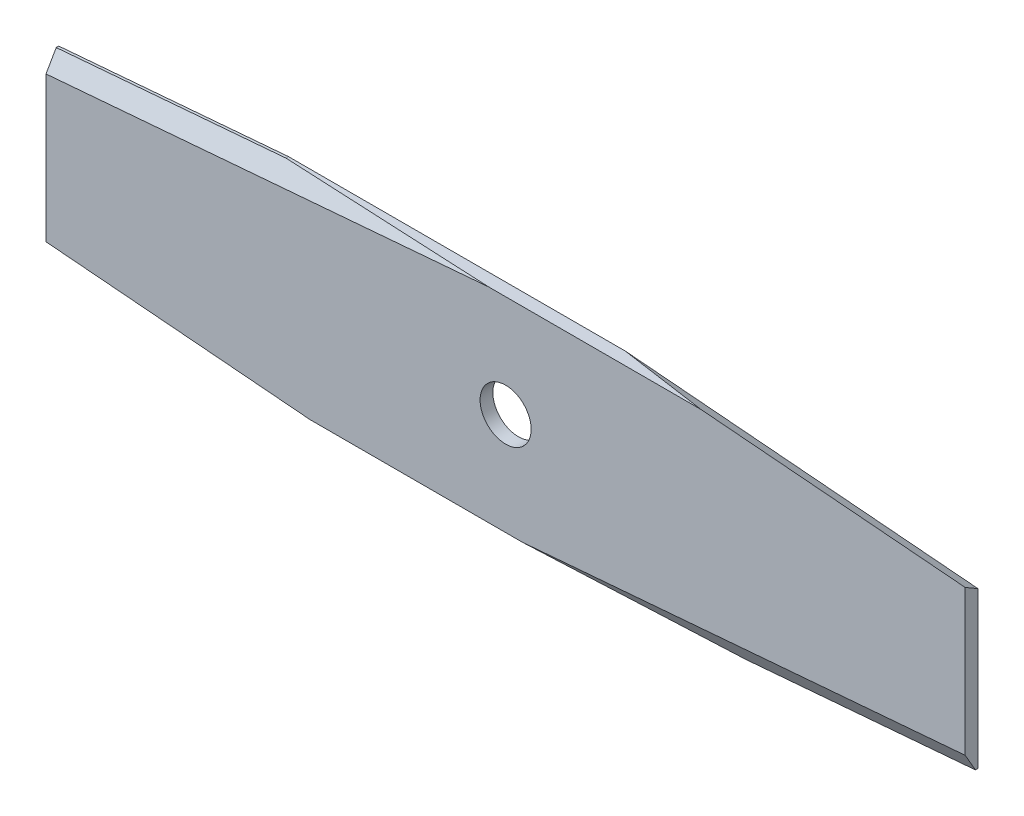
ISO-10303-21;
HEADER;
FILE_DESCRIPTION(('STEP AP214'),'2;1');
FILE_NAME('part.step','',(''),(''),'','','');
FILE_SCHEMA(('AUTOMOTIVE_DESIGN { 1 0 10303 214 1 1 1 1 }'));
ENDSEC;
DATA;
#1=APPLICATION_CONTEXT('core data for automotive mechanical design processes');
#2=APPLICATION_PROTOCOL_DEFINITION('international standard','automotive_design',2000,#1);
#3=PRODUCT_CONTEXT('',#1,'mechanical');
#4=PRODUCT('Part','Part','',(#3));
#5=PRODUCT_RELATED_PRODUCT_CATEGORY('part','',(#4));
#6=PRODUCT_DEFINITION_FORMATION('','',#4);
#7=PRODUCT_DEFINITION_CONTEXT('part definition',#1,'design');
#8=PRODUCT_DEFINITION('design','',#6,#7);
#9=PRODUCT_DEFINITION_SHAPE('','',#8);
#10=(LENGTH_UNIT() NAMED_UNIT(*) SI_UNIT(.MILLI.,.METRE.));
#11=(NAMED_UNIT(*) PLANE_ANGLE_UNIT() SI_UNIT($,.RADIAN.));
#12=(NAMED_UNIT(*) SI_UNIT($,.STERADIAN.) SOLID_ANGLE_UNIT());
#13=UNCERTAINTY_MEASURE_WITH_UNIT(LENGTH_MEASURE(1.E-05),#10,'distance_accuracy_value','');
#14=(GEOMETRIC_REPRESENTATION_CONTEXT(3) GLOBAL_UNCERTAINTY_ASSIGNED_CONTEXT((#13)) GLOBAL_UNIT_ASSIGNED_CONTEXT((#10,
#11,#12)) REPRESENTATION_CONTEXT('',''));
#15=CARTESIAN_POINT('',(0.,0.,0.));
#16=DIRECTION('',(0.,0.,1.));
#17=DIRECTION('',(1.,0.,0.));
#18=AXIS2_PLACEMENT_3D('',#15,#16,#17);
#19=CARTESIAN_POINT('',(-57.15,25.4,3.175));
#20=DIRECTION('',(0.0830454798537402,-0.99654575824488,0.));
#21=DIRECTION('',(0.99654575824488,0.0830454798537402,0.));
#22=AXIS2_PLACEMENT_3D('',#19,#20,#21);
#23=PLANE('',#22);
#24=DIRECTION('',(0.,0.,-1.));
#25=VECTOR('',#24,1.);
#26=CARTESIAN_POINT('',(-114.3,20.6375,3.175));
#27=LINE('',#26,#25);
#28=CARTESIAN_POINT('',(-114.3,20.6375,0.635000000000014));
#29=VERTEX_POINT('',#28);
#30=CARTESIAN_POINT('',(-114.3,20.6375,0.));
#31=VERTEX_POINT('',#30);
#32=EDGE_CURVE('E106',#29,#31,#27,.T.);
#33=ORIENTED_EDGE('',*,*,#32,.F.);
#34=DIRECTION('',(0.99654575824488,0.0830454798537402,0.));
#35=VECTOR('',#34,1.);
#36=CARTESIAN_POINT('',(-57.15,25.4,0.635000000000013));
#37=LINE('',#36,#35);
#38=CARTESIAN_POINT('',(-57.15,25.4,0.635000000000013));
#39=VERTEX_POINT('',#38);
#40=EDGE_CURVE('E40',#29,#39,#37,.T.);
#41=ORIENTED_EDGE('',*,*,#40,.T.);
#42=DIRECTION('',(0.,0.,-1.));
#43=VECTOR('',#42,1.);
#44=CARTESIAN_POINT('',(-57.15,25.4,3.175));
#45=LINE('',#44,#43);
#46=CARTESIAN_POINT('',(-57.15,25.4,0.));
#47=VERTEX_POINT('',#46);
#48=EDGE_CURVE('E128',#39,#47,#45,.T.);
#49=ORIENTED_EDGE('',*,*,#48,.T.);
#50=DIRECTION('',(-0.99654575824488,-0.0830454798537402,0.));
#51=VECTOR('',#50,1.);
#52=CARTESIAN_POINT('',(-57.15,25.4,0.));
#53=LINE('',#52,#51);
#54=EDGE_CURVE('E121',#47,#31,#53,.T.);
#55=ORIENTED_EDGE('',*,*,#54,.T.);
#56=EDGE_LOOP('',(#33,#41,#49,#55));
#57=FACE_BOUND('',#56,.T.);
#58=ADVANCED_FACE('F32',(#57),#23,.F.);
#59=CARTESIAN_POINT('',(-114.3,20.6375,3.175));
#60=DIRECTION('',(1.,0.,0.));
#61=DIRECTION('',(0.,0.,-1.));
#62=AXIS2_PLACEMENT_3D('',#59,#60,#61);
#63=PLANE('',#62);
#64=DIRECTION('',(0.,-1.,0.));
#65=VECTOR('',#64,1.);
#66=CARTESIAN_POINT('',(-114.3,20.6375,0.));
#67=LINE('',#66,#65);
#68=CARTESIAN_POINT('',(-114.3,-18.0886958141556,0.));
#69=VERTEX_POINT('',#68);
#70=EDGE_CURVE('E109',#31,#69,#67,.T.);
#71=ORIENTED_EDGE('',*,*,#70,.T.);
#72=DIRECTION('',(0.,0.501298141518371,-0.865274623059192));
#73=VECTOR('',#72,1.);
#74=CARTESIAN_POINT('',(-114.3,-20.6375,4.39940905122504));
#75=LINE('',#74,#73);
#76=CARTESIAN_POINT('',(-114.3,-19.9281367926667,3.175));
#77=VERTEX_POINT('',#76);
#78=EDGE_CURVE('E180',#69,#77,#75,.F.);
#79=ORIENTED_EDGE('',*,*,#78,.T.);
#80=DIRECTION('',(0.,-1.,0.));
#81=VECTOR('',#80,1.);
#82=CARTESIAN_POINT('',(-114.3,20.6375,3.175));
#83=LINE('',#82,#81);
#84=CARTESIAN_POINT('',(-114.3,16.2228416515734,3.175));
#85=VERTEX_POINT('',#84);
#86=EDGE_CURVE('E149',#85,#77,#83,.T.);
#87=ORIENTED_EDGE('',*,*,#86,.F.);
#88=DIRECTION('',(0.,0.866772944194476,-0.498702980954034));
#89=VECTOR('',#88,1.);
#90=CARTESIAN_POINT('',(-114.3,16.2457155290264,3.16183937823834));
#91=LINE('',#90,#89);
#92=EDGE_CURVE('E47',#85,#29,#91,.T.);
#93=ORIENTED_EDGE('',*,*,#92,.T.);
#94=ORIENTED_EDGE('',*,*,#32,.T.);
#95=EDGE_LOOP('',(#71,#79,#87,#93,#94));
#96=FACE_BOUND('',#95,.T.);
#97=ADVANCED_FACE('F108',(#96),#63,.F.);
#98=CARTESIAN_POINT('',(57.15,-25.4,3.175));
#99=DIRECTION('',(0.,1.,0.));
#100=DIRECTION('',(-1.,0.,0.));
#101=AXIS2_PLACEMENT_3D('',#98,#99,#100);
#102=PLANE('',#101);
#103=DIRECTION('',(1.,0.,0.));
#104=VECTOR('',#103,1.);
#105=CARTESIAN_POINT('',(57.15,-25.4,3.175));
#106=LINE('',#105,#104);
#107=CARTESIAN_POINT('',(-48.6376415120013,-25.4,3.17500000000006));
#108=VERTEX_POINT('',#107);
#109=CARTESIAN_POINT('',(4.17409981887519,-25.4,3.17500000000013));
#110=VERTEX_POINT('',#109);
#111=EDGE_CURVE('E194',#108,#110,#106,.T.);
#112=ORIENTED_EDGE('',*,*,#111,.F.);
#113=DIRECTION('',(-0.989812977147566,0.,0.142373699362877));
#114=VECTOR('',#113,1.);
#115=CARTESIAN_POINT('',(-113.141554054054,-25.4000000000001,12.4531776598414));
#116=LINE('',#115,#114);
#117=CARTESIAN_POINT('',(-26.5643497698673,-25.4,0.));
#118=VERTEX_POINT('',#117);
#119=EDGE_CURVE('E177',#108,#118,#116,.F.);
#120=ORIENTED_EDGE('',*,*,#119,.T.);
#121=DIRECTION('',(1.,0.,0.));
#122=VECTOR('',#121,1.);
#123=CARTESIAN_POINT('',(57.15,-25.4,0.));
#124=LINE('',#123,#122);
#125=CARTESIAN_POINT('',(57.15,-25.4,0.));
#126=VERTEX_POINT('',#125);
#127=EDGE_CURVE('E125',#118,#126,#124,.T.);
#128=ORIENTED_EDGE('',*,*,#127,.T.);
#129=DIRECTION('',(0.,0.,-1.));
#130=VECTOR('',#129,1.);
#131=CARTESIAN_POINT('',(57.15,-25.4,3.175));
#132=LINE('',#131,#130);
#133=CARTESIAN_POINT('',(57.15,-25.4,0.635000000000002));
#134=VERTEX_POINT('',#133);
#135=EDGE_CURVE('E114',#134,#126,#132,.T.);
#136=ORIENTED_EDGE('',*,*,#135,.F.);
#137=DIRECTION('',(-0.998852552691511,0.,0.0478913142610582));
#138=VECTOR('',#137,1.);
#139=CARTESIAN_POINT('',(-109.411820185148,-25.4000000000001,8.6210280207387));
#140=LINE('',#139,#138);
#141=EDGE_CURVE('E175',#134,#110,#140,.T.);
#142=ORIENTED_EDGE('',*,*,#141,.T.);
#143=EDGE_LOOP('',(#112,#120,#128,#136,#142));
#144=FACE_BOUND('',#143,.T.);
#145=ADVANCED_FACE('F217',(#144),#102,.F.);
#146=CARTESIAN_POINT('',(57.15,-25.4,3.175));
#147=DIRECTION('',(-0.0830454798537405,0.99654575824488,0.));
#148=DIRECTION('',(-0.99654575824488,-0.0830454798537405,0.));
#149=AXIS2_PLACEMENT_3D('',#146,#147,#148);
#150=PLANE('',#149);
#151=DIRECTION('',(0.,0.,-1.));
#152=VECTOR('',#151,1.);
#153=CARTESIAN_POINT('',(114.3,-20.6375,3.175));
#154=LINE('',#153,#152);
#155=CARTESIAN_POINT('',(114.3,-20.6375,0.635));
#156=VERTEX_POINT('',#155);
#157=CARTESIAN_POINT('',(114.3,-20.6375,0.));
#158=VERTEX_POINT('',#157);
#159=EDGE_CURVE('E151',#156,#158,#154,.T.);
#160=ORIENTED_EDGE('',*,*,#159,.F.);
#161=DIRECTION('',(-0.99654575824488,-0.0830454798537405,0.));
#162=VECTOR('',#161,1.);
#163=CARTESIAN_POINT('',(57.15,-25.4,0.635));
#164=LINE('',#163,#162);
#165=EDGE_CURVE('E11',#156,#134,#164,.T.);
#166=ORIENTED_EDGE('',*,*,#165,.T.);
#167=ORIENTED_EDGE('',*,*,#135,.T.);
#168=DIRECTION('',(0.99654575824488,0.0830454798537405,0.));
#169=VECTOR('',#168,1.);
#170=CARTESIAN_POINT('',(57.15,-25.4,0.));
#171=LINE('',#170,#169);
#172=EDGE_CURVE('E141',#126,#158,#171,.T.);
#173=ORIENTED_EDGE('',*,*,#172,.T.);
#174=EDGE_LOOP('',(#160,#166,#167,#173));
#175=FACE_BOUND('',#174,.T.);
#176=ADVANCED_FACE('F211',(#175),#150,.F.);
#177=CARTESIAN_POINT('',(114.3,-20.6375,3.175));
#178=DIRECTION('',(-1.,0.,0.));
#179=DIRECTION('',(0.,0.,1.));
#180=AXIS2_PLACEMENT_3D('',#177,#178,#179);
#181=PLANE('',#180);
#182=DIRECTION('',(0.,1.,0.));
#183=VECTOR('',#182,1.);
#184=CARTESIAN_POINT('',(114.3,-20.6375,0.));
#185=LINE('',#184,#183);
#186=CARTESIAN_POINT('',(114.3,18.0886958141556,0.));
#187=VERTEX_POINT('',#186);
#188=EDGE_CURVE('E144',#158,#187,#185,.T.);
#189=ORIENTED_EDGE('',*,*,#188,.T.);
#190=DIRECTION('',(0.,-0.50129814151837,-0.865274623059193));
#191=VECTOR('',#190,1.);
#192=CARTESIAN_POINT('',(114.3,20.6375,4.39940905122504));
#193=LINE('',#192,#191);
#194=CARTESIAN_POINT('',(114.3,19.9281367926667,3.175));
#195=VERTEX_POINT('',#194);
#196=EDGE_CURVE('E173',#187,#195,#193,.F.);
#197=ORIENTED_EDGE('',*,*,#196,.T.);
#198=DIRECTION('',(0.,1.,0.));
#199=VECTOR('',#198,1.);
#200=CARTESIAN_POINT('',(114.3,-20.6375,3.175));
#201=LINE('',#200,#199);
#202=CARTESIAN_POINT('',(114.3,-16.2228416515734,3.175));
#203=VERTEX_POINT('',#202);
#204=EDGE_CURVE('E197',#203,#195,#201,.T.);
#205=ORIENTED_EDGE('',*,*,#204,.F.);
#206=DIRECTION('',(0.,-0.866772944194477,-0.498702980954033));
#207=VECTOR('',#206,1.);
#208=CARTESIAN_POINT('',(114.3,-30.2453269279901,-4.89292050279322));
#209=LINE('',#208,#207);
#210=EDGE_CURVE('E171',#203,#156,#209,.T.);
#211=ORIENTED_EDGE('',*,*,#210,.T.);
#212=ORIENTED_EDGE('',*,*,#159,.T.);
#213=EDGE_LOOP('',(#189,#197,#205,#211,#212));
#214=FACE_BOUND('',#213,.T.);
#215=ADVANCED_FACE('F210',(#214),#181,.F.);
#216=CARTESIAN_POINT('',(-57.15,25.4,3.175));
#217=DIRECTION('',(0.,-1.,0.));
#218=DIRECTION('',(1.,0.,0.));
#219=AXIS2_PLACEMENT_3D('',#216,#217,#218);
#220=PLANE('',#219);
#221=DIRECTION('',(-1.,0.,0.));
#222=VECTOR('',#221,1.);
#223=CARTESIAN_POINT('',(-57.15,25.4,3.175));
#224=LINE('',#223,#222);
#225=CARTESIAN_POINT('',(48.637641512001,25.4,3.17500000000004));
#226=VERTEX_POINT('',#225);
#227=CARTESIAN_POINT('',(-4.17409981887512,25.4,3.17500000000014));
#228=VERTEX_POINT('',#227);
#229=EDGE_CURVE('E136',#226,#228,#224,.T.);
#230=ORIENTED_EDGE('',*,*,#229,.F.);
#231=DIRECTION('',(0.989812977147567,0.,0.142373699362877));
#232=VECTOR('',#231,1.);
#233=CARTESIAN_POINT('',(113.141554054054,25.4,12.4531776598414));
#234=LINE('',#233,#232);
#235=CARTESIAN_POINT('',(26.5643497698674,25.4,0.));
#236=VERTEX_POINT('',#235);
#237=EDGE_CURVE('E165',#226,#236,#234,.F.);
#238=ORIENTED_EDGE('',*,*,#237,.T.);
#239=DIRECTION('',(-1.,0.,0.));
#240=VECTOR('',#239,1.);
#241=CARTESIAN_POINT('',(-57.15,25.4,0.));
#242=LINE('',#241,#240);
#243=EDGE_CURVE('E147',#236,#47,#242,.T.);
#244=ORIENTED_EDGE('',*,*,#243,.T.);
#245=ORIENTED_EDGE('',*,*,#48,.F.);
#246=DIRECTION('',(0.998852552691512,0.,0.0478913142610582));
#247=VECTOR('',#246,1.);
#248=CARTESIAN_POINT('',(-113.682904585494,25.4,-2.07554530751195));
#249=LINE('',#248,#247);
#250=EDGE_CURVE('E163',#39,#228,#249,.T.);
#251=ORIENTED_EDGE('',*,*,#250,.T.);
#252=EDGE_LOOP('',(#230,#238,#244,#245,#251));
#253=FACE_BOUND('',#252,.T.);
#254=ADVANCED_FACE('F185',(#253),#220,.F.);
#255=CARTESIAN_POINT('',(-114.3,20.6375,3.175));
#256=DIRECTION('',(0.,0.,1.));
#257=DIRECTION('',(1.,0.,0.));
#258=AXIS2_PLACEMENT_3D('',#255,#256,#257);
#259=PLANE('',#258);
#260=CARTESIAN_POINT('',(0.,0.,3.175));
#261=DIRECTION('',(0.,0.,1.));
#262=DIRECTION('',(1.,0.,0.));
#263=AXIS2_PLACEMENT_3D('',#260,#261,#262);
#264=CIRCLE('',#263,6.35);
#265=CARTESIAN_POINT('',(6.35,0.,3.175));
#266=VERTEX_POINT('',#265);
#267=EDGE_CURVE('E133',#266,#266,#264,.T.);
#268=ORIENTED_EDGE('',*,*,#267,.F.);
#269=EDGE_LOOP('',(#268));
#270=FACE_BOUND('',#269,.T.);
#271=ORIENTED_EDGE('',*,*,#204,.T.);
#272=DIRECTION('',(0.99654575824488,-0.0830454798537405,0.));
#273=VECTOR('',#272,1.);
#274=CARTESIAN_POINT('',(-112.782154196469,38.8516496423726,3.175));
#275=LINE('',#274,#273);
#276=EDGE_CURVE('E161',#195,#226,#275,.F.);
#277=ORIENTED_EDGE('',*,*,#276,.T.);
#278=ORIENTED_EDGE('',*,*,#229,.T.);
#279=DIRECTION('',(-0.99654575824488,-0.0830454798537402,0.));
#280=VECTOR('',#279,1.);
#281=CARTESIAN_POINT('',(-113.934648964268,16.2532875712177,3.175));
#282=LINE('',#281,#280);
#283=EDGE_CURVE('E156',#228,#85,#282,.T.);
#284=ORIENTED_EDGE('',*,*,#283,.T.);
#285=ORIENTED_EDGE('',*,*,#86,.T.);
#286=DIRECTION('',(-0.99654575824488,0.0830454798537407,0.));
#287=VECTOR('',#286,1.);
#288=CARTESIAN_POINT('',(-117.657156148359,-19.6483737803035,3.175));
#289=LINE('',#288,#287);
#290=EDGE_CURVE('E159',#77,#108,#289,.F.);
#291=ORIENTED_EDGE('',*,*,#290,.T.);
#292=ORIENTED_EDGE('',*,*,#111,.T.);
#293=DIRECTION('',(0.99654575824488,0.0830454798537405,0.));
#294=VECTOR('',#293,1.);
#295=CARTESIAN_POINT('',(113.934648964268,-16.2532875712177,3.175));
#296=LINE('',#295,#294);
#297=EDGE_CURVE('E113',#110,#203,#296,.T.);
#298=ORIENTED_EDGE('',*,*,#297,.T.);
#299=EDGE_LOOP('',(#271,#277,#278,#284,#285,#291,#292,#298));
#300=FACE_BOUND('',#299,.T.);
#301=ADVANCED_FACE('F192',(#270,#300),#259,.T.);
#302=CARTESIAN_POINT('',(-114.3,20.6375,0.));
#303=DIRECTION('',(0.,0.,1.));
#304=DIRECTION('',(1.,0.,0.));
#305=AXIS2_PLACEMENT_3D('',#302,#303,#304);
#306=PLANE('',#305);
#307=CARTESIAN_POINT('',(0.,0.,0.));
#308=DIRECTION('',(0.,0.,1.));
#309=DIRECTION('',(1.,0.,0.));
#310=AXIS2_PLACEMENT_3D('',#307,#308,#309);
#311=CIRCLE('',#310,6.35);
#312=CARTESIAN_POINT('',(6.35,0.,0.));
#313=VERTEX_POINT('',#312);
#314=EDGE_CURVE('E130',#313,#313,#311,.T.);
#315=ORIENTED_EDGE('',*,*,#314,.T.);
#316=EDGE_LOOP('',(#315));
#317=FACE_BOUND('',#316,.T.);
#318=ORIENTED_EDGE('',*,*,#243,.F.);
#319=DIRECTION('',(0.99654575824488,-0.0830454798537405,0.));
#320=VECTOR('',#319,1.);
#321=CARTESIAN_POINT('',(-112.934383794691,37.0248944637133,0.));
#322=LINE('',#321,#320);
#323=EDGE_CURVE('E168',#236,#187,#322,.T.);
#324=ORIENTED_EDGE('',*,*,#323,.T.);
#325=ORIENTED_EDGE('',*,*,#188,.F.);
#326=ORIENTED_EDGE('',*,*,#172,.F.);
#327=ORIENTED_EDGE('',*,*,#127,.F.);
#328=DIRECTION('',(-0.99654575824488,0.0830454798537407,0.));
#329=VECTOR('',#328,1.);
#330=CARTESIAN_POINT('',(-117.504926550137,-17.8216186016442,0.));
#331=LINE('',#330,#329);
#332=EDGE_CURVE('E124',#118,#69,#331,.T.);
#333=ORIENTED_EDGE('',*,*,#332,.T.);
#334=ORIENTED_EDGE('',*,*,#70,.F.);
#335=ORIENTED_EDGE('',*,*,#54,.F.);
#336=EDGE_LOOP('',(#318,#324,#325,#326,#327,#333,#334,#335));
#337=FACE_BOUND('',#336,.T.);
#338=ADVANCED_FACE('F120',(#317,#337),#306,.F.);
#339=CARTESIAN_POINT('',(0.,0.,0.));
#340=DIRECTION('',(0.,0.,1.));
#341=DIRECTION('',(1.,0.,0.));
#342=AXIS2_PLACEMENT_3D('',#339,#340,#341);
#343=CYLINDRICAL_SURFACE('',#342,6.35);
#344=ORIENTED_EDGE('',*,*,#314,.F.);
#345=EDGE_LOOP('',(#344));
#346=FACE_BOUND('',#345,.T.);
#347=ORIENTED_EDGE('',*,*,#267,.T.);
#348=EDGE_LOOP('',(#347));
#349=FACE_BOUND('',#348,.T.);
#350=ADVANCED_FACE('F234',(#346,#349),#343,.F.);
#351=CARTESIAN_POINT('',(114.3,20.6375,4.39940905122504));
#352=DIRECTION('',(-0.0719194952228082,-0.863033942673693,0.499999999999997));
#353=DIRECTION('',(0.,-0.50129814151837,-0.865274623059193));
#354=AXIS2_PLACEMENT_3D('',#351,#352,#353);
#355=PLANE('',#354);
#356=ORIENTED_EDGE('',*,*,#196,.F.);
#357=ORIENTED_EDGE('',*,*,#323,.F.);
#358=ORIENTED_EDGE('',*,*,#237,.F.);
#359=ORIENTED_EDGE('',*,*,#276,.F.);
#360=EDGE_LOOP('',(#356,#357,#358,#359));
#361=FACE_BOUND('',#360,.T.);
#362=ADVANCED_FACE('F206',(#361),#355,.F.);
#363=CARTESIAN_POINT('',(-114.3,-20.6375,4.39940905122504));
#364=DIRECTION('',(0.0719194952228083,0.863033942673692,0.499999999999998));
#365=DIRECTION('',(0.,-0.501298141518371,0.865274623059192));
#366=AXIS2_PLACEMENT_3D('',#363,#364,#365);
#367=PLANE('',#366);
#368=ORIENTED_EDGE('',*,*,#78,.F.);
#369=ORIENTED_EDGE('',*,*,#332,.F.);
#370=ORIENTED_EDGE('',*,*,#119,.F.);
#371=ORIENTED_EDGE('',*,*,#290,.F.);
#372=EDGE_LOOP('',(#368,#369,#370,#371));
#373=FACE_BOUND('',#372,.T.);
#374=ADVANCED_FACE('F215',(#373),#367,.F.);
#375=CARTESIAN_POINT('',(-113.934648964268,16.2532875712177,3.175));
#376=DIRECTION('',(-0.0415227399268705,0.498272879122444,0.866025403784436));
#377=DIRECTION('',(0.,-0.866772944194476,0.498702980954034));
#378=AXIS2_PLACEMENT_3D('',#375,#376,#377);
#379=PLANE('',#378);
#380=ORIENTED_EDGE('',*,*,#250,.F.);
#381=ORIENTED_EDGE('',*,*,#40,.F.);
#382=ORIENTED_EDGE('',*,*,#92,.F.);
#383=ORIENTED_EDGE('',*,*,#283,.F.);
#384=EDGE_LOOP('',(#380,#381,#382,#383));
#385=FACE_BOUND('',#384,.T.);
#386=ADVANCED_FACE('F188',(#385),#379,.T.);
#387=CARTESIAN_POINT('',(-109.672937242628,-34.8872530884592,3.175));
#388=DIRECTION('',(0.0415227399268705,-0.498272879122443,0.866025403784437));
#389=DIRECTION('',(0.,-0.866772944194477,-0.498702980954033));
#390=AXIS2_PLACEMENT_3D('',#387,#388,#389);
#391=PLANE('',#390);
#392=ORIENTED_EDGE('',*,*,#141,.F.);
#393=ORIENTED_EDGE('',*,*,#165,.F.);
#394=ORIENTED_EDGE('',*,*,#210,.F.);
#395=ORIENTED_EDGE('',*,*,#297,.F.);
#396=EDGE_LOOP('',(#392,#393,#394,#395));
#397=FACE_BOUND('',#396,.T.);
#398=ADVANCED_FACE('F34',(#397),#391,.T.);
#399=CLOSED_SHELL('',(#58,#97,#145,#176,#215,#254,#301,#338,#350,#362,#374,#386,#398));
#400=MANIFOLD_SOLID_BREP('B2',#399);
#401=ADVANCED_BREP_SHAPE_REPRESENTATION('',(#18,#400),#14);
#402=SHAPE_DEFINITION_REPRESENTATION(#9,#401);
ENDSEC;
END-ISO-10303-21;
